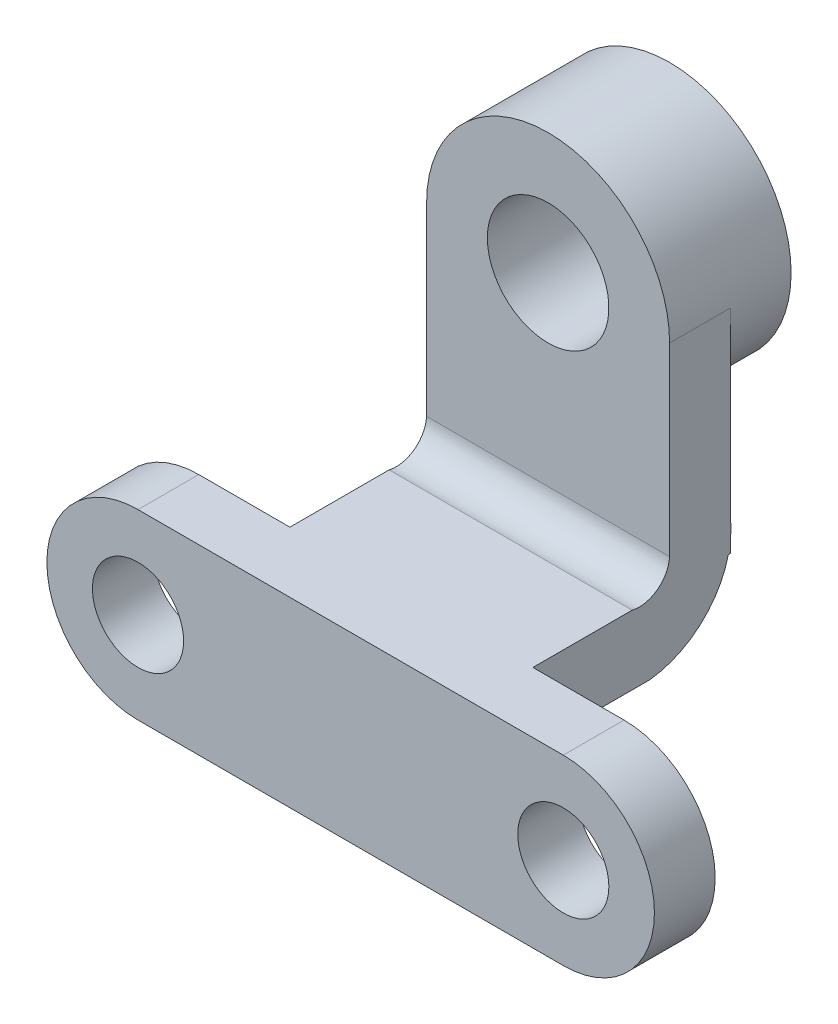
ISO-10303-21;
HEADER;
FILE_DESCRIPTION(('STEP AP214'),'2;1');
FILE_NAME('part.step','',(''),(''),'','','');
FILE_SCHEMA(('AUTOMOTIVE_DESIGN { 1 0 10303 214 1 1 1 1 }'));
ENDSEC;
DATA;
#1=APPLICATION_CONTEXT('core data for automotive mechanical design processes');
#2=APPLICATION_PROTOCOL_DEFINITION('international standard','automotive_design',2000,#1);
#3=PRODUCT_CONTEXT('',#1,'mechanical');
#4=PRODUCT('Part','Part','',(#3));
#5=PRODUCT_RELATED_PRODUCT_CATEGORY('part','',(#4));
#6=PRODUCT_DEFINITION_FORMATION('','',#4);
#7=PRODUCT_DEFINITION_CONTEXT('part definition',#1,'design');
#8=PRODUCT_DEFINITION('design','',#6,#7);
#9=PRODUCT_DEFINITION_SHAPE('','',#8);
#10=(LENGTH_UNIT() NAMED_UNIT(*) SI_UNIT(.MILLI.,.METRE.));
#11=(NAMED_UNIT(*) PLANE_ANGLE_UNIT() SI_UNIT($,.RADIAN.));
#12=(NAMED_UNIT(*) SI_UNIT($,.STERADIAN.) SOLID_ANGLE_UNIT());
#13=UNCERTAINTY_MEASURE_WITH_UNIT(LENGTH_MEASURE(1.E-05),#10,'distance_accuracy_value','');
#14=(GEOMETRIC_REPRESENTATION_CONTEXT(3) GLOBAL_UNCERTAINTY_ASSIGNED_CONTEXT((#13)) GLOBAL_UNIT_ASSIGNED_CONTEXT((#10,
#11,#12)) REPRESENTATION_CONTEXT('',''));
#15=CARTESIAN_POINT('',(0.,0.,0.));
#16=DIRECTION('',(0.,0.,1.));
#17=DIRECTION('',(1.,0.,0.));
#18=AXIS2_PLACEMENT_3D('',#15,#16,#17);
#19=CARTESIAN_POINT('',(-40.4090909090909,50.4391700222086,-69.8756657555292));
#20=DIRECTION('',(1.,0.,0.));
#21=DIRECTION('',(0.,0.,-1.));
#22=AXIS2_PLACEMENT_3D('',#19,#20,#21);
#23=CYLINDRICAL_SURFACE('',#22,12.7);
#24=CARTESIAN_POINT('',(61.1909090909091,50.4391700222086,-69.8756657555292));
#25=DIRECTION('',(-1.,0.,0.));
#26=DIRECTION('',(0.,0.,1.));
#27=AXIS2_PLACEMENT_3D('',#24,#25,#26);
#28=CIRCLE('',#27,12.7);
#29=CARTESIAN_POINT('',(61.1909090909091,49.6321684983966,-82.55));
#30=VERTEX_POINT('',#29);
#31=CARTESIAN_POINT('',(61.1909090909091,38.1,-66.8698575176289));
#32=VERTEX_POINT('',#31);
#33=EDGE_CURVE('E205',#30,#32,#28,.T.);
#34=ORIENTED_EDGE('',*,*,#33,.F.);
#35=DIRECTION('',(1.,0.,0.));
#36=VECTOR('',#35,1.);
#37=CARTESIAN_POINT('',(-40.4090909090909,49.6321684983966,-82.55));
#38=LINE('',#37,#36);
#39=CARTESIAN_POINT('',(-40.4090909090909,49.6321684983966,-82.55));
#40=VERTEX_POINT('',#39);
#41=EDGE_CURVE('E175',#30,#40,#38,.F.);
#42=ORIENTED_EDGE('',*,*,#41,.T.);
#43=CARTESIAN_POINT('',(-40.4090909090909,50.4391700222086,-69.8756657555292));
#44=DIRECTION('',(-1.,0.,0.));
#45=DIRECTION('',(0.,0.,1.));
#46=AXIS2_PLACEMENT_3D('',#43,#44,#45);
#47=CIRCLE('',#46,12.7);
#48=CARTESIAN_POINT('',(-40.4090909090909,38.1,-66.8698575176289));
#49=VERTEX_POINT('',#48);
#50=EDGE_CURVE('E206',#40,#49,#47,.T.);
#51=ORIENTED_EDGE('',*,*,#50,.T.);
#52=DIRECTION('',(1.,0.,0.));
#53=VECTOR('',#52,1.);
#54=CARTESIAN_POINT('',(-40.4090909090909,38.1,-66.8698575176289));
#55=LINE('',#54,#53);
#56=EDGE_CURVE('E220',#49,#32,#55,.T.);
#57=ORIENTED_EDGE('',*,*,#56,.T.);
#58=EDGE_LOOP('',(#34,#42,#51,#57));
#59=FACE_BOUND('',#58,.T.);
#60=ADVANCED_FACE('F37',(#59),#23,.F.);
#61=CARTESIAN_POINT('',(-40.4090909090909,47.0761919586322,-70.0788860707694));
#62=DIRECTION('',(1.,0.,0.));
#63=DIRECTION('',(0.,0.,-1.));
#64=AXIS2_PLACEMENT_3D('',#61,#62,#63);
#65=CYLINDRICAL_SURFACE('',#64,38.1);
#66=CARTESIAN_POINT('',(-40.4090909090909,47.0761919586322,-70.0788860707694));
#67=DIRECTION('',(1.,0.,0.));
#68=DIRECTION('',(0.,0.,1.));
#69=AXIS2_PLACEMENT_3D('',#66,#67,#68);
#70=CIRCLE('',#69,38.1);
#71=CARTESIAN_POINT('',(-40.4090909090909,9.20507802940189,-74.2488656581607));
#72=VERTEX_POINT('',#71);
#73=CARTESIAN_POINT('',(-40.4090909090909,38.1,-107.106416071051));
#74=VERTEX_POINT('',#73);
#75=EDGE_CURVE('E54',#72,#74,#70,.T.);
#76=ORIENTED_EDGE('',*,*,#75,.T.);
#77=DIRECTION('',(1.,0.,0.));
#78=VECTOR('',#77,1.);
#79=CARTESIAN_POINT('',(-40.4090909090909,38.1,-107.106416071051));
#80=LINE('',#79,#78);
#81=CARTESIAN_POINT('',(61.1909090909091,38.1,-107.106416071051));
#82=VERTEX_POINT('',#81);
#83=EDGE_CURVE('E173',#74,#82,#80,.T.);
#84=ORIENTED_EDGE('',*,*,#83,.T.);
#85=CARTESIAN_POINT('',(61.1909090909091,47.0761919586322,-70.0788860707694));
#86=DIRECTION('',(1.,0.,0.));
#87=DIRECTION('',(0.,0.,1.));
#88=AXIS2_PLACEMENT_3D('',#85,#86,#87);
#89=CIRCLE('',#88,38.1);
#90=CARTESIAN_POINT('',(61.1909090909091,9.20507802940189,-74.2488656581607));
#91=VERTEX_POINT('',#90);
#92=EDGE_CURVE('E209',#91,#82,#89,.T.);
#93=ORIENTED_EDGE('',*,*,#92,.F.);
#94=DIRECTION('',(1.,0.,0.));
#95=VECTOR('',#94,1.);
#96=CARTESIAN_POINT('',(-40.4090909090909,9.20507802940189,-74.2488656581607));
#97=LINE('',#96,#95);
#98=EDGE_CURVE('E233',#72,#91,#97,.T.);
#99=ORIENTED_EDGE('',*,*,#98,.F.);
#100=EDGE_LOOP('',(#76,#84,#93,#99));
#101=FACE_BOUND('',#100,.T.);
#102=ADVANCED_FACE('F307',(#101),#65,.T.);
#103=CARTESIAN_POINT('',(-78.5090909090909,0.,-25.4));
#104=DIRECTION('',(0.,0.,1.));
#105=DIRECTION('',(1.,0.,0.));
#106=AXIS2_PLACEMENT_3D('',#103,#104,#105);
#107=PLANE('',#106);
#108=CARTESIAN_POINT('',(-78.5090909090909,0.,-25.4));
#109=DIRECTION('',(0.,0.,1.));
#110=DIRECTION('',(1.,0.,0.));
#111=AXIS2_PLACEMENT_3D('',#108,#109,#110);
#112=CIRCLE('',#111,19.05);
#113=CARTESIAN_POINT('',(-59.4590909090909,0.,-25.4));
#114=VERTEX_POINT('',#113);
#115=EDGE_CURVE('E246',#114,#114,#112,.T.);
#116=ORIENTED_EDGE('',*,*,#115,.T.);
#117=EDGE_LOOP('',(#116));
#118=FACE_BOUND('',#117,.T.);
#119=CARTESIAN_POINT('',(99.2909090909091,0.,-25.4));
#120=DIRECTION('',(0.,0.,1.));
#121=DIRECTION('',(1.,0.,0.));
#122=AXIS2_PLACEMENT_3D('',#119,#120,#121);
#123=CIRCLE('',#122,19.05);
#124=CARTESIAN_POINT('',(118.340909090909,0.,-25.4));
#125=VERTEX_POINT('',#124);
#126=EDGE_CURVE('E240',#125,#125,#123,.T.);
#127=ORIENTED_EDGE('',*,*,#126,.T.);
#128=EDGE_LOOP('',(#127));
#129=FACE_BOUND('',#128,.T.);
#130=DIRECTION('',(0.,-1.,0.));
#131=VECTOR('',#130,1.);
#132=CARTESIAN_POINT('',(61.1909090909091,9.20507802940188,-25.4));
#133=LINE('',#132,#131);
#134=CARTESIAN_POINT('',(61.1909090909091,38.1,-25.4));
#135=VERTEX_POINT('',#134);
#136=CARTESIAN_POINT('',(61.1909090909091,9.20507802940188,-25.4));
#137=VERTEX_POINT('',#136);
#138=EDGE_CURVE('E224',#135,#137,#133,.T.);
#139=ORIENTED_EDGE('',*,*,#138,.F.);
#140=DIRECTION('',(-1.,0.,0.));
#141=VECTOR('',#140,1.);
#142=CARTESIAN_POINT('',(-78.5090909090909,38.1,-25.4));
#143=LINE('',#142,#141);
#144=CARTESIAN_POINT('',(99.2909090909091,38.1,-25.4));
#145=VERTEX_POINT('',#144);
#146=EDGE_CURVE('E263',#145,#135,#143,.T.);
#147=ORIENTED_EDGE('',*,*,#146,.F.);
#148=CARTESIAN_POINT('',(99.2909090909091,0.,-25.4));
#149=DIRECTION('',(0.,0.,1.));
#150=DIRECTION('',(1.,0.,0.));
#151=AXIS2_PLACEMENT_3D('',#148,#149,#150);
#152=CIRCLE('',#151,38.1);
#153=CARTESIAN_POINT('',(99.2909090909091,-38.1,-25.4));
#154=VERTEX_POINT('',#153);
#155=EDGE_CURVE('E259',#154,#145,#152,.T.);
#156=ORIENTED_EDGE('',*,*,#155,.F.);
#157=DIRECTION('',(1.,0.,0.));
#158=VECTOR('',#157,1.);
#159=CARTESIAN_POINT('',(-78.5090909090909,-38.1,-25.4));
#160=LINE('',#159,#158);
#161=CARTESIAN_POINT('',(-78.5090909090909,-38.1,-25.4));
#162=VERTEX_POINT('',#161);
#163=EDGE_CURVE('E255',#162,#154,#160,.T.);
#164=ORIENTED_EDGE('',*,*,#163,.F.);
#165=CARTESIAN_POINT('',(-78.5090909090909,0.,-25.4));
#166=DIRECTION('',(0.,0.,1.));
#167=DIRECTION('',(1.,0.,0.));
#168=AXIS2_PLACEMENT_3D('',#165,#166,#167);
#169=CIRCLE('',#168,38.1);
#170=CARTESIAN_POINT('',(-78.5090909090909,38.1,-25.4));
#171=VERTEX_POINT('',#170);
#172=EDGE_CURVE('E252',#171,#162,#169,.T.);
#173=ORIENTED_EDGE('',*,*,#172,.F.);
#174=CARTESIAN_POINT('',(-40.4090909090909,38.1,-25.4));
#175=VERTEX_POINT('',#174);
#176=EDGE_CURVE('E262',#175,#171,#143,.T.);
#177=ORIENTED_EDGE('',*,*,#176,.F.);
#178=DIRECTION('',(0.,-1.,0.));
#179=VECTOR('',#178,1.);
#180=CARTESIAN_POINT('',(-40.4090909090909,9.20507802940188,-25.4));
#181=LINE('',#180,#179);
#182=CARTESIAN_POINT('',(-40.4090909090909,9.20507802940188,-25.4));
#183=VERTEX_POINT('',#182);
#184=EDGE_CURVE('E212',#175,#183,#181,.T.);
#185=ORIENTED_EDGE('',*,*,#184,.T.);
#186=DIRECTION('',(1.,0.,0.));
#187=VECTOR('',#186,1.);
#188=CARTESIAN_POINT('',(-40.4090909090909,9.20507802940188,-25.4));
#189=LINE('',#188,#187);
#190=EDGE_CURVE('E235',#183,#137,#189,.T.);
#191=ORIENTED_EDGE('',*,*,#190,.T.);
#192=EDGE_LOOP('',(#139,#147,#156,#164,#173,#177,#185,#191));
#193=FACE_BOUND('',#192,.T.);
#194=ADVANCED_FACE('F294',(#118,#129,#193),#107,.F.);
#195=CARTESIAN_POINT('',(-78.5090909090909,0.,-25.4));
#196=DIRECTION('',(0.,0.,1.));
#197=DIRECTION('',(1.,0.,0.));
#198=AXIS2_PLACEMENT_3D('',#195,#196,#197);
#199=CYLINDRICAL_SURFACE('',#198,38.1);
#200=CARTESIAN_POINT('',(-78.5090909090909,0.,0.));
#201=DIRECTION('',(0.,0.,1.));
#202=DIRECTION('',(1.,0.,0.));
#203=AXIS2_PLACEMENT_3D('',#200,#201,#202);
#204=CIRCLE('',#203,38.1);
#205=CARTESIAN_POINT('',(-78.5090909090909,38.1,0.));
#206=VERTEX_POINT('',#205);
#207=CARTESIAN_POINT('',(-78.5090909090909,-38.1,0.));
#208=VERTEX_POINT('',#207);
#209=EDGE_CURVE('E249',#206,#208,#204,.T.);
#210=ORIENTED_EDGE('',*,*,#209,.F.);
#211=DIRECTION('',(0.,0.,1.));
#212=VECTOR('',#211,1.);
#213=CARTESIAN_POINT('',(-78.5090909090909,38.1,-25.4));
#214=LINE('',#213,#212);
#215=EDGE_CURVE('E11',#171,#206,#214,.T.);
#216=ORIENTED_EDGE('',*,*,#215,.F.);
#217=ORIENTED_EDGE('',*,*,#172,.T.);
#218=DIRECTION('',(0.,0.,1.));
#219=VECTOR('',#218,1.);
#220=CARTESIAN_POINT('',(-78.5090909090909,-38.1,-25.4));
#221=LINE('',#220,#219);
#222=EDGE_CURVE('E41',#162,#208,#221,.T.);
#223=ORIENTED_EDGE('',*,*,#222,.T.);
#224=EDGE_LOOP('',(#210,#216,#217,#223));
#225=FACE_BOUND('',#224,.T.);
#226=ADVANCED_FACE('F39',(#225),#199,.T.);
#227=CARTESIAN_POINT('',(-78.5090909090909,38.1,-25.4));
#228=DIRECTION('',(0.,1.,0.));
#229=DIRECTION('',(0.,0.,1.));
#230=AXIS2_PLACEMENT_3D('',#227,#228,#229);
#231=PLANE('',#230);
#232=DIRECTION('',(-1.,0.,0.));
#233=VECTOR('',#232,1.);
#234=CARTESIAN_POINT('',(-78.5090909090909,38.1,0.));
#235=LINE('',#234,#233);
#236=CARTESIAN_POINT('',(99.2909090909091,38.1,0.));
#237=VERTEX_POINT('',#236);
#238=EDGE_CURVE('E256',#237,#206,#235,.T.);
#239=ORIENTED_EDGE('',*,*,#238,.F.);
#240=DIRECTION('',(0.,0.,1.));
#241=VECTOR('',#240,1.);
#242=CARTESIAN_POINT('',(99.2909090909091,38.1,-25.4));
#243=LINE('',#242,#241);
#244=EDGE_CURVE('E46',#145,#237,#243,.T.);
#245=ORIENTED_EDGE('',*,*,#244,.F.);
#246=ORIENTED_EDGE('',*,*,#146,.T.);
#247=DIRECTION('',(0.,0.,1.));
#248=VECTOR('',#247,1.);
#249=CARTESIAN_POINT('',(61.1909090909091,38.1,-25.4));
#250=LINE('',#249,#248);
#251=EDGE_CURVE('E222',#32,#135,#250,.T.);
#252=ORIENTED_EDGE('',*,*,#251,.F.);
#253=ORIENTED_EDGE('',*,*,#56,.F.);
#254=DIRECTION('',(0.,0.,1.));
#255=VECTOR('',#254,1.);
#256=CARTESIAN_POINT('',(-40.4090909090909,38.1,-25.4));
#257=LINE('',#256,#255);
#258=EDGE_CURVE('E208',#49,#175,#257,.T.);
#259=ORIENTED_EDGE('',*,*,#258,.T.);
#260=ORIENTED_EDGE('',*,*,#176,.T.);
#261=ORIENTED_EDGE('',*,*,#215,.T.);
#262=EDGE_LOOP('',(#239,#245,#246,#252,#253,#259,#260,#261));
#263=FACE_BOUND('',#262,.T.);
#264=ADVANCED_FACE('F290',(#263),#231,.T.);
#265=CARTESIAN_POINT('',(99.2909090909091,0.,-25.4));
#266=DIRECTION('',(0.,0.,1.));
#267=DIRECTION('',(1.,0.,0.));
#268=AXIS2_PLACEMENT_3D('',#265,#266,#267);
#269=CYLINDRICAL_SURFACE('',#268,38.1);
#270=CARTESIAN_POINT('',(99.2909090909091,0.,0.));
#271=DIRECTION('',(0.,0.,1.));
#272=DIRECTION('',(1.,0.,0.));
#273=AXIS2_PLACEMENT_3D('',#270,#271,#272);
#274=CIRCLE('',#273,38.1);
#275=CARTESIAN_POINT('',(99.2909090909091,-38.1,0.));
#276=VERTEX_POINT('',#275);
#277=EDGE_CURVE('E271',#276,#237,#274,.T.);
#278=ORIENTED_EDGE('',*,*,#277,.F.);
#279=DIRECTION('',(0.,0.,1.));
#280=VECTOR('',#279,1.);
#281=CARTESIAN_POINT('',(99.2909090909091,-38.1,-25.4));
#282=LINE('',#281,#280);
#283=EDGE_CURVE('E276',#154,#276,#282,.T.);
#284=ORIENTED_EDGE('',*,*,#283,.F.);
#285=ORIENTED_EDGE('',*,*,#155,.T.);
#286=ORIENTED_EDGE('',*,*,#244,.T.);
#287=EDGE_LOOP('',(#278,#284,#285,#286));
#288=FACE_BOUND('',#287,.T.);
#289=ADVANCED_FACE('F298',(#288),#269,.T.);
#290=CARTESIAN_POINT('',(-78.5090909090909,-38.1,-25.4));
#291=DIRECTION('',(0.,-1.,0.));
#292=DIRECTION('',(0.,0.,-1.));
#293=AXIS2_PLACEMENT_3D('',#290,#291,#292);
#294=PLANE('',#293);
#295=DIRECTION('',(1.,0.,0.));
#296=VECTOR('',#295,1.);
#297=CARTESIAN_POINT('',(-78.5090909090909,-38.1,0.));
#298=LINE('',#297,#296);
#299=EDGE_CURVE('E268',#208,#276,#298,.T.);
#300=ORIENTED_EDGE('',*,*,#299,.F.);
#301=ORIENTED_EDGE('',*,*,#222,.F.);
#302=ORIENTED_EDGE('',*,*,#163,.T.);
#303=ORIENTED_EDGE('',*,*,#283,.T.);
#304=EDGE_LOOP('',(#300,#301,#302,#303));
#305=FACE_BOUND('',#304,.T.);
#306=ADVANCED_FACE('F285',(#305),#294,.T.);
#307=CARTESIAN_POINT('',(-78.5090909090909,0.,0.));
#308=DIRECTION('',(0.,0.,1.));
#309=DIRECTION('',(1.,0.,0.));
#310=AXIS2_PLACEMENT_3D('',#307,#308,#309);
#311=PLANE('',#310);
#312=CARTESIAN_POINT('',(99.2909090909091,0.,0.));
#313=DIRECTION('',(0.,0.,1.));
#314=DIRECTION('',(1.,0.,0.));
#315=AXIS2_PLACEMENT_3D('',#312,#313,#314);
#316=CIRCLE('',#315,19.05);
#317=CARTESIAN_POINT('',(118.340909090909,0.,0.));
#318=VERTEX_POINT('',#317);
#319=EDGE_CURVE('E232',#318,#318,#316,.T.);
#320=ORIENTED_EDGE('',*,*,#319,.F.);
#321=EDGE_LOOP('',(#320));
#322=FACE_BOUND('',#321,.T.);
#323=CARTESIAN_POINT('',(-78.5090909090909,0.,0.));
#324=DIRECTION('',(0.,0.,1.));
#325=DIRECTION('',(1.,0.,0.));
#326=AXIS2_PLACEMENT_3D('',#323,#324,#325);
#327=CIRCLE('',#326,19.05);
#328=CARTESIAN_POINT('',(-59.4590909090909,0.,0.));
#329=VERTEX_POINT('',#328);
#330=EDGE_CURVE('E243',#329,#329,#327,.T.);
#331=ORIENTED_EDGE('',*,*,#330,.F.);
#332=EDGE_LOOP('',(#331));
#333=FACE_BOUND('',#332,.T.);
#334=ORIENTED_EDGE('',*,*,#209,.T.);
#335=ORIENTED_EDGE('',*,*,#299,.T.);
#336=ORIENTED_EDGE('',*,*,#277,.T.);
#337=ORIENTED_EDGE('',*,*,#238,.T.);
#338=EDGE_LOOP('',(#334,#335,#336,#337));
#339=FACE_BOUND('',#338,.T.);
#340=ADVANCED_FACE('F287',(#322,#333,#339),#311,.T.);
#341=CARTESIAN_POINT('',(-78.5090909090909,0.,-25.4));
#342=DIRECTION('',(0.,0.,1.));
#343=DIRECTION('',(1.,0.,0.));
#344=AXIS2_PLACEMENT_3D('',#341,#342,#343);
#345=CYLINDRICAL_SURFACE('',#344,19.05);
#346=ORIENTED_EDGE('',*,*,#115,.F.);
#347=EDGE_LOOP('',(#346));
#348=FACE_BOUND('',#347,.T.);
#349=ORIENTED_EDGE('',*,*,#330,.T.);
#350=EDGE_LOOP('',(#349));
#351=FACE_BOUND('',#350,.T.);
#352=ADVANCED_FACE('F322',(#348,#351),#345,.F.);
#353=CARTESIAN_POINT('',(99.2909090909091,0.,-25.4));
#354=DIRECTION('',(0.,0.,1.));
#355=DIRECTION('',(1.,0.,0.));
#356=AXIS2_PLACEMENT_3D('',#353,#354,#355);
#357=CYLINDRICAL_SURFACE('',#356,19.05);
#358=ORIENTED_EDGE('',*,*,#126,.F.);
#359=EDGE_LOOP('',(#358));
#360=FACE_BOUND('',#359,.T.);
#361=ORIENTED_EDGE('',*,*,#319,.T.);
#362=EDGE_LOOP('',(#361));
#363=FACE_BOUND('',#362,.T.);
#364=ADVANCED_FACE('F319',(#360,#363),#357,.F.);
#365=DIRECTION('',(1.,0.,0.));
#366=VECTOR('',#365,1.);
#367=CARTESIAN_POINT('',(-40.4090909090909,42.9062123712437,-107.95));
#368=LINE('',#367,#366);
#369=CARTESIAN_POINT('',(-40.4090909090909,42.9062123712437,-107.95));
#370=VERTEX_POINT('',#369);
#371=CARTESIAN_POINT('',(61.1909090909091,42.9062123712437,-107.95));
#372=VERTEX_POINT('',#371);
#373=EDGE_CURVE('E203',#370,#372,#368,.T.);
#374=ORIENTED_EDGE('',*,*,#373,.F.);
#375=CARTESIAN_POINT('',(-40.4090909090909,51.2461715460206,-107.95));
#376=VERTEX_POINT('',#375);
#377=EDGE_CURVE('E218',#370,#376,#70,.T.);
#378=ORIENTED_EDGE('',*,*,#377,.T.);
#379=DIRECTION('',(1.,0.,0.));
#380=VECTOR('',#379,1.);
#381=CARTESIAN_POINT('',(-40.4090909090909,51.2461715460206,-107.95));
#382=LINE('',#381,#380);
#383=CARTESIAN_POINT('',(61.1909090909091,51.2461715460206,-107.95));
#384=VERTEX_POINT('',#383);
#385=EDGE_CURVE('E152',#376,#384,#382,.T.);
#386=ORIENTED_EDGE('',*,*,#385,.T.);
#387=EDGE_CURVE('E62',#372,#384,#89,.T.);
#388=ORIENTED_EDGE('',*,*,#387,.F.);
#389=EDGE_LOOP('',(#374,#378,#386,#388));
#390=FACE_BOUND('',#389,.T.);
#391=ADVANCED_FACE('F314',(#390),#65,.T.);
#392=CARTESIAN_POINT('',(-40.4090909090909,9.20507802940189,-74.2488656581607));
#393=DIRECTION('',(0.,-1.,0.));
#394=DIRECTION('',(0.,0.,-1.));
#395=AXIS2_PLACEMENT_3D('',#392,#393,#394);
#396=PLANE('',#395);
#397=DIRECTION('',(0.,0.,-1.));
#398=VECTOR('',#397,1.);
#399=CARTESIAN_POINT('',(61.1909090909091,9.20507802940189,-74.2488656581607));
#400=LINE('',#399,#398);
#401=EDGE_CURVE('E226',#137,#91,#400,.T.);
#402=ORIENTED_EDGE('',*,*,#401,.F.);
#403=ORIENTED_EDGE('',*,*,#190,.F.);
#404=DIRECTION('',(0.,0.,-1.));
#405=VECTOR('',#404,1.);
#406=CARTESIAN_POINT('',(-40.4090909090909,9.20507802940189,-74.2488656581607));
#407=LINE('',#406,#405);
#408=EDGE_CURVE('E215',#183,#72,#407,.T.);
#409=ORIENTED_EDGE('',*,*,#408,.T.);
#410=ORIENTED_EDGE('',*,*,#98,.T.);
#411=EDGE_LOOP('',(#402,#403,#409,#410));
#412=FACE_BOUND('',#411,.T.);
#413=ADVANCED_FACE('F318',(#412),#396,.T.);
#414=CARTESIAN_POINT('',(-40.4090909090909,50.4391700222086,-69.8756657555292));
#415=DIRECTION('',(-1.,0.,0.));
#416=DIRECTION('',(0.,0.,1.));
#417=AXIS2_PLACEMENT_3D('',#414,#415,#416);
#418=PLANE('',#417);
#419=ORIENTED_EDGE('',*,*,#377,.F.);
#420=DIRECTION('',(0.,1.,0.));
#421=VECTOR('',#420,1.);
#422=CARTESIAN_POINT('',(-40.4090909090909,127.,-107.95));
#423=LINE('',#422,#421);
#424=CARTESIAN_POINT('',(-40.4090909090909,38.1,-107.95));
#425=VERTEX_POINT('',#424);
#426=EDGE_CURVE('E155',#425,#370,#423,.T.);
#427=ORIENTED_EDGE('',*,*,#426,.F.);
#428=DIRECTION('',(0.,0.,1.));
#429=VECTOR('',#428,1.);
#430=CARTESIAN_POINT('',(-40.4090909090909,38.1,-107.95));
#431=LINE('',#430,#429);
#432=EDGE_CURVE('E166',#425,#74,#431,.T.);
#433=ORIENTED_EDGE('',*,*,#432,.T.);
#434=ORIENTED_EDGE('',*,*,#75,.F.);
#435=ORIENTED_EDGE('',*,*,#408,.F.);
#436=ORIENTED_EDGE('',*,*,#184,.F.);
#437=ORIENTED_EDGE('',*,*,#258,.F.);
#438=ORIENTED_EDGE('',*,*,#50,.F.);
#439=DIRECTION('',(0.,1.,0.));
#440=VECTOR('',#439,1.);
#441=CARTESIAN_POINT('',(-40.4090909090909,127.,-82.55));
#442=LINE('',#441,#440);
#443=CARTESIAN_POINT('',(-40.4090909090909,127.,-82.55));
#444=VERTEX_POINT('',#443);
#445=EDGE_CURVE('E162',#40,#444,#442,.T.);
#446=ORIENTED_EDGE('',*,*,#445,.T.);
#447=DIRECTION('',(0.,0.,1.));
#448=VECTOR('',#447,1.);
#449=CARTESIAN_POINT('',(-40.4090909090909,127.,-107.95));
#450=LINE('',#449,#448);
#451=CARTESIAN_POINT('',(-40.4090909090909,127.,-107.95));
#452=VERTEX_POINT('',#451);
#453=EDGE_CURVE('E159',#452,#444,#450,.T.);
#454=ORIENTED_EDGE('',*,*,#453,.F.);
#455=EDGE_CURVE('E146',#376,#452,#423,.T.);
#456=ORIENTED_EDGE('',*,*,#455,.F.);
#457=EDGE_LOOP('',(#419,#427,#433,#434,#435,#436,#437,#438,#446,#454,#456));
#458=FACE_BOUND('',#457,.T.);
#459=ADVANCED_FACE('F160',(#458),#418,.T.);
#460=CARTESIAN_POINT('',(61.1909090909091,50.4391700222086,-69.8756657555292));
#461=DIRECTION('',(-1.,0.,0.));
#462=DIRECTION('',(0.,0.,1.));
#463=AXIS2_PLACEMENT_3D('',#460,#461,#462);
#464=PLANE('',#463);
#465=ORIENTED_EDGE('',*,*,#387,.T.);
#466=DIRECTION('',(0.,-1.,0.));
#467=VECTOR('',#466,1.);
#468=CARTESIAN_POINT('',(61.1909090909091,127.,-107.95));
#469=LINE('',#468,#467);
#470=CARTESIAN_POINT('',(61.1909090909091,127.,-107.95));
#471=VERTEX_POINT('',#470);
#472=EDGE_CURVE('E187',#471,#384,#469,.T.);
#473=ORIENTED_EDGE('',*,*,#472,.F.);
#474=DIRECTION('',(0.,0.,1.));
#475=VECTOR('',#474,1.);
#476=CARTESIAN_POINT('',(61.1909090909091,127.,-107.95));
#477=LINE('',#476,#475);
#478=CARTESIAN_POINT('',(61.1909090909091,127.,-82.55));
#479=VERTEX_POINT('',#478);
#480=EDGE_CURVE('E172',#471,#479,#477,.T.);
#481=ORIENTED_EDGE('',*,*,#480,.T.);
#482=DIRECTION('',(0.,-1.,0.));
#483=VECTOR('',#482,1.);
#484=CARTESIAN_POINT('',(61.1909090909091,127.,-82.55));
#485=LINE('',#484,#483);
#486=EDGE_CURVE('E193',#479,#30,#485,.T.);
#487=ORIENTED_EDGE('',*,*,#486,.T.);
#488=ORIENTED_EDGE('',*,*,#33,.T.);
#489=ORIENTED_EDGE('',*,*,#251,.T.);
#490=ORIENTED_EDGE('',*,*,#138,.T.);
#491=ORIENTED_EDGE('',*,*,#401,.T.);
#492=ORIENTED_EDGE('',*,*,#92,.T.);
#493=DIRECTION('',(0.,0.,1.));
#494=VECTOR('',#493,1.);
#495=CARTESIAN_POINT('',(61.1909090909091,38.1,-107.95));
#496=LINE('',#495,#494);
#497=CARTESIAN_POINT('',(61.1909090909091,38.1,-107.95));
#498=VERTEX_POINT('',#497);
#499=EDGE_CURVE('E177',#498,#82,#496,.T.);
#500=ORIENTED_EDGE('',*,*,#499,.F.);
#501=EDGE_CURVE('E189',#372,#498,#469,.T.);
#502=ORIENTED_EDGE('',*,*,#501,.F.);
#503=EDGE_LOOP('',(#465,#473,#481,#487,#488,#489,#490,#491,#492,#500,#502));
#504=FACE_BOUND('',#503,.T.);
#505=ADVANCED_FACE('F367',(#504),#464,.F.);
#506=CARTESIAN_POINT('',(-40.4090909090909,38.1,-107.95));
#507=DIRECTION('',(0.,1.,0.));
#508=DIRECTION('',(0.,0.,1.));
#509=AXIS2_PLACEMENT_3D('',#506,#507,#508);
#510=PLANE('',#509);
#511=ORIENTED_EDGE('',*,*,#83,.F.);
#512=ORIENTED_EDGE('',*,*,#432,.F.);
#513=DIRECTION('',(-1.,0.,0.));
#514=VECTOR('',#513,1.);
#515=CARTESIAN_POINT('',(-40.4090909090909,38.1,-107.95));
#516=LINE('',#515,#514);
#517=EDGE_CURVE('E156',#498,#425,#516,.T.);
#518=ORIENTED_EDGE('',*,*,#517,.F.);
#519=ORIENTED_EDGE('',*,*,#499,.T.);
#520=EDGE_LOOP('',(#511,#512,#518,#519));
#521=FACE_BOUND('',#520,.T.);
#522=ADVANCED_FACE('F374',(#521),#510,.F.);
#523=CARTESIAN_POINT('',(10.3909090909091,127.,-107.95));
#524=DIRECTION('',(0.,0.,-1.));
#525=DIRECTION('',(-1.,0.,0.));
#526=AXIS2_PLACEMENT_3D('',#523,#524,#525);
#527=PLANE('',#526);
#528=ORIENTED_EDGE('',*,*,#426,.T.);
#529=ORIENTED_EDGE('',*,*,#373,.T.);
#530=ORIENTED_EDGE('',*,*,#501,.T.);
#531=ORIENTED_EDGE('',*,*,#517,.T.);
#532=EDGE_LOOP('',(#528,#529,#530,#531));
#533=FACE_BOUND('',#532,.T.);
#534=ADVANCED_FACE('F382',(#533),#527,.T.);
#535=ORIENTED_EDGE('',*,*,#472,.T.);
#536=ORIENTED_EDGE('',*,*,#385,.F.);
#537=ORIENTED_EDGE('',*,*,#455,.T.);
#538=CARTESIAN_POINT('',(10.3909090909091,127.,-107.95));
#539=DIRECTION('',(0.,0.,-1.));
#540=DIRECTION('',(-1.,0.,0.));
#541=AXIS2_PLACEMENT_3D('',#538,#539,#540);
#542=CIRCLE('',#541,50.8);
#543=EDGE_CURVE('E150',#471,#452,#542,.T.);
#544=ORIENTED_EDGE('',*,*,#543,.F.);
#545=EDGE_LOOP('',(#535,#536,#537,#544));
#546=FACE_BOUND('',#545,.T.);
#547=ADVANCED_FACE('F148',(#546),#527,.T.);
#548=CARTESIAN_POINT('',(10.3909090909091,127.,-82.55));
#549=DIRECTION('',(0.,0.,-1.));
#550=DIRECTION('',(-1.,0.,0.));
#551=AXIS2_PLACEMENT_3D('',#548,#549,#550);
#552=PLANE('',#551);
#553=ORIENTED_EDGE('',*,*,#41,.F.);
#554=ORIENTED_EDGE('',*,*,#486,.F.);
#555=CARTESIAN_POINT('',(10.3909090909091,127.,-82.55));
#556=DIRECTION('',(0.,0.,-1.));
#557=DIRECTION('',(-1.,0.,0.));
#558=AXIS2_PLACEMENT_3D('',#555,#556,#557);
#559=CIRCLE('',#558,50.8);
#560=EDGE_CURVE('E186',#444,#479,#559,.T.);
#561=ORIENTED_EDGE('',*,*,#560,.F.);
#562=ORIENTED_EDGE('',*,*,#445,.F.);
#563=EDGE_LOOP('',(#553,#554,#561,#562));
#564=FACE_BOUND('',#563,.T.);
#565=CARTESIAN_POINT('',(10.3909090909091,127.,-82.55));
#566=DIRECTION('',(0.,0.,-1.));
#567=DIRECTION('',(-1.,0.,0.));
#568=AXIS2_PLACEMENT_3D('',#565,#566,#567);
#569=CIRCLE('',#568,25.4);
#570=CARTESIAN_POINT('',(-15.0090909090909,127.,-82.55));
#571=VERTEX_POINT('',#570);
#572=EDGE_CURVE('E183',#571,#571,#569,.T.);
#573=ORIENTED_EDGE('',*,*,#572,.T.);
#574=EDGE_LOOP('',(#573));
#575=FACE_BOUND('',#574,.T.);
#576=ADVANCED_FACE('F397',(#564,#575),#552,.F.);
#577=CARTESIAN_POINT('',(10.3909090909091,127.,-107.95));
#578=DIRECTION('',(0.,0.,1.));
#579=DIRECTION('',(1.,0.,0.));
#580=AXIS2_PLACEMENT_3D('',#577,#578,#579);
#581=CYLINDRICAL_SURFACE('',#580,50.8);
#582=ORIENTED_EDGE('',*,*,#560,.T.);
#583=ORIENTED_EDGE('',*,*,#480,.F.);
#584=ORIENTED_EDGE('',*,*,#543,.T.);
#585=ORIENTED_EDGE('',*,*,#453,.T.);
#586=EDGE_LOOP('',(#582,#583,#584,#585));
#587=FACE_BOUND('',#586,.T.);
#588=CARTESIAN_POINT('',(10.3909090909091,127.,-133.35));
#589=DIRECTION('',(0.,0.,-1.));
#590=DIRECTION('',(-1.,0.,0.));
#591=AXIS2_PLACEMENT_3D('',#588,#589,#590);
#592=CIRCLE('',#591,50.8);
#593=CARTESIAN_POINT('',(-40.4090909090909,127.,-133.35));
#594=VERTEX_POINT('',#593);
#595=EDGE_CURVE('E181',#594,#594,#592,.T.);
#596=ORIENTED_EDGE('',*,*,#595,.F.);
#597=EDGE_LOOP('',(#596));
#598=FACE_BOUND('',#597,.T.);
#599=ADVANCED_FACE('F169',(#587,#598),#581,.T.);
#600=CARTESIAN_POINT('',(10.3909090909091,127.,-107.95));
#601=DIRECTION('',(0.,0.,1.));
#602=DIRECTION('',(1.,0.,0.));
#603=AXIS2_PLACEMENT_3D('',#600,#601,#602);
#604=CYLINDRICAL_SURFACE('',#603,25.4);
#605=ORIENTED_EDGE('',*,*,#572,.F.);
#606=EDGE_LOOP('',(#605));
#607=FACE_BOUND('',#606,.T.);
#608=CARTESIAN_POINT('',(10.3909090909091,127.,-133.35));
#609=DIRECTION('',(0.,0.,-1.));
#610=DIRECTION('',(-1.,0.,0.));
#611=AXIS2_PLACEMENT_3D('',#608,#609,#610);
#612=CIRCLE('',#611,25.4);
#613=CARTESIAN_POINT('',(-15.0090909090909,127.,-133.35));
#614=VERTEX_POINT('',#613);
#615=EDGE_CURVE('E554',#614,#614,#612,.T.);
#616=ORIENTED_EDGE('',*,*,#615,.T.);
#617=EDGE_LOOP('',(#616));
#618=FACE_BOUND('',#617,.T.);
#619=ADVANCED_FACE('F410',(#607,#618),#604,.F.);
#620=CARTESIAN_POINT('',(10.3909090909091,127.,-133.35));
#621=DIRECTION('',(0.,0.,-1.));
#622=DIRECTION('',(-1.,0.,0.));
#623=AXIS2_PLACEMENT_3D('',#620,#621,#622);
#624=PLANE('',#623);
#625=ORIENTED_EDGE('',*,*,#595,.T.);
#626=EDGE_LOOP('',(#625));
#627=FACE_BOUND('',#626,.T.);
#628=ORIENTED_EDGE('',*,*,#615,.F.);
#629=EDGE_LOOP('',(#628));
#630=FACE_BOUND('',#629,.T.);
#631=ADVANCED_FACE('F417',(#627,#630),#624,.T.);
#632=CLOSED_SHELL('',(#60,#102,#194,#226,#264,#289,#306,#340,#352,#364,#391,#413,#459,#505,#522,
#534,#547,#576,#599,#619,#631));
#633=MANIFOLD_SOLID_BREP('B2',#632);
#634=ADVANCED_BREP_SHAPE_REPRESENTATION('',(#18,#633),#14);
#635=SHAPE_DEFINITION_REPRESENTATION(#9,#634);
ENDSEC;
END-ISO-10303-21;
